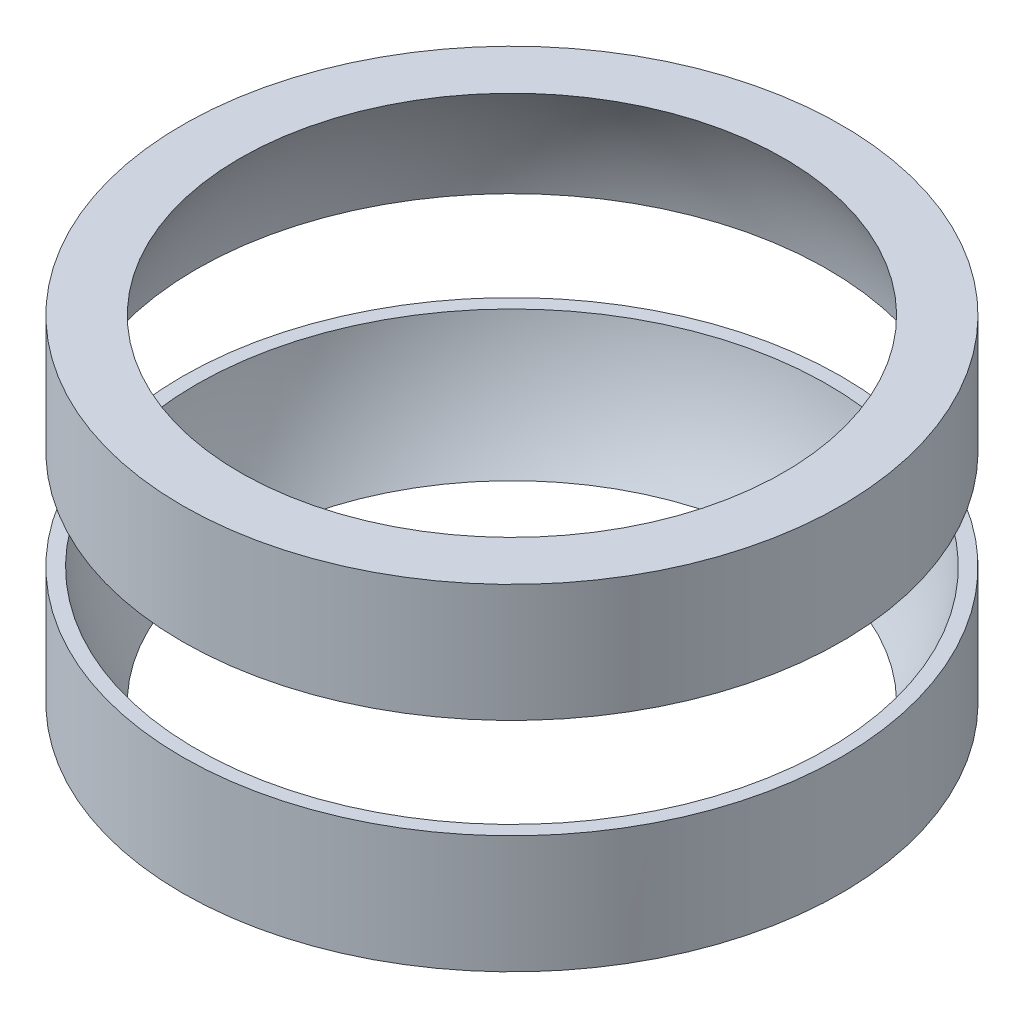
ISO-10303-21;
HEADER;
FILE_DESCRIPTION(('STEP AP214'),'2;1');
FILE_NAME('part.step','',(''),(''),'','','');
FILE_SCHEMA(('AUTOMOTIVE_DESIGN { 1 0 10303 214 1 1 1 1 }'));
ENDSEC;
DATA;
#1=APPLICATION_CONTEXT('core data for automotive mechanical design processes');
#2=APPLICATION_PROTOCOL_DEFINITION('international standard','automotive_design',2000,#1);
#3=PRODUCT_CONTEXT('',#1,'mechanical');
#4=PRODUCT('Part','Part','',(#3));
#5=PRODUCT_RELATED_PRODUCT_CATEGORY('part','',(#4));
#6=PRODUCT_DEFINITION_FORMATION('','',#4);
#7=PRODUCT_DEFINITION_CONTEXT('part definition',#1,'design');
#8=PRODUCT_DEFINITION('design','',#6,#7);
#9=PRODUCT_DEFINITION_SHAPE('','',#8);
#10=(LENGTH_UNIT() NAMED_UNIT(*) SI_UNIT(.MILLI.,.METRE.));
#11=(NAMED_UNIT(*) PLANE_ANGLE_UNIT() SI_UNIT($,.RADIAN.));
#12=(NAMED_UNIT(*) SI_UNIT($,.STERADIAN.) SOLID_ANGLE_UNIT());
#13=UNCERTAINTY_MEASURE_WITH_UNIT(LENGTH_MEASURE(1.E-05),#10,'distance_accuracy_value','');
#14=(GEOMETRIC_REPRESENTATION_CONTEXT(3) GLOBAL_UNCERTAINTY_ASSIGNED_CONTEXT((#13)) GLOBAL_UNIT_ASSIGNED_CONTEXT((#10,
#11,#12)) REPRESENTATION_CONTEXT('',''));
#15=CARTESIAN_POINT('',(0.,0.,0.));
#16=DIRECTION('',(0.,0.,1.));
#17=DIRECTION('',(1.,0.,0.));
#18=AXIS2_PLACEMENT_3D('',#15,#16,#17);
#19=CARTESIAN_POINT('',(0.,0.,0.));
#20=DIRECTION('',(0.,1.,0.));
#21=DIRECTION('',(-1.,0.,0.));
#22=AXIS2_PLACEMENT_3D('',#19,#20,#21);
#23=SPHERICAL_SURFACE('',#22,8.);
#24=CARTESIAN_POINT('',(0.,-1.25,0.));
#25=DIRECTION('',(0.,-1.,0.));
#26=DIRECTION('',(0.,0.,-1.));
#27=AXIS2_PLACEMENT_3D('',#24,#25,#26);
#28=CIRCLE('',#27,7.90174031463955);
#29=CARTESIAN_POINT('',(-7.90174031463955,-1.25,0.));
#30=VERTEX_POINT('',#29);
#31=EDGE_CURVE('E48',#30,#30,#28,.T.);
#32=CARTESIAN_POINT('',(0.,-4.2,0.));
#33=DIRECTION('',(0.,1.,0.));
#34=DIRECTION('',(0.,0.,1.));
#35=AXIS2_PLACEMENT_3D('',#32,#33,#34);
#36=CIRCLE('',#35,6.80881781221968);
#37=CARTESIAN_POINT('',(-6.80881781221968,-4.2,0.));
#38=VERTEX_POINT('',#37);
#39=EDGE_CURVE('E56',#38,#38,#36,.T.);
#40=CARTESIAN_POINT('',(-7.90174031463955,-1.25,0.));
#41=CARTESIAN_POINT('',(-7.89658639024555,-1.28258004946365,0.));
#42=CARTESIAN_POINT('',(-7.89123094559052,-1.31512821958967,0.));
#43=CARTESIAN_POINT('',(-7.88011788367745,-1.38015582955022,0.));
#44=CARTESIAN_POINT('',(-7.8743602664194,-1.41263526938476,0.));
#45=CARTESIAN_POINT('',(-7.86244372721932,-1.47752044714619,0.));
#46=CARTESIAN_POINT('',(-7.85628480527729,-1.50992618507308,0.));
#47=CARTESIAN_POINT('',(-7.84356660251608,-1.57465900149719,0.));
#48=CARTESIAN_POINT('',(-7.83700732169689,-1.60698607999442,0.));
#49=CARTESIAN_POINT('',(-7.82348940382575,-1.67155663131721,0.));
#50=CARTESIAN_POINT('',(-7.81653076677378,-1.70380010414277,0.));
#51=CARTESIAN_POINT('',(-7.80221520136718,-1.76819851087429,0.));
#52=CARTESIAN_POINT('',(-7.79485827301255,-1.80035344478024,0.));
#53=CARTESIAN_POINT('',(-7.77974725055261,-1.86456985391695,0.));
#54=CARTESIAN_POINT('',(-7.7719931564473,-1.89663132914771,0.));
#55=CARTESIAN_POINT('',(-7.75608898888983,-1.96065591549226,0.));
#56=CARTESIAN_POINT('',(-7.74793891543766,-1.99261902660606,0.));
#57=CARTESIAN_POINT('',(-7.73124403615285,-2.05644199432086,0.));
#58=CARTESIAN_POINT('',(-7.7226992303202,-2.08830185092187,0.));
#59=CARTESIAN_POINT('',(-7.70521619364142,-2.15191343501436,0.));
#60=CARTESIAN_POINT('',(-7.6962779627953,-2.18366516250585,0.));
#61=CARTESIAN_POINT('',(-7.67800944364946,-2.24705563032621,0.));
#62=CARTESIAN_POINT('',(-7.66867915534974,-2.27869437065507,0.));
#63=CARTESIAN_POINT('',(-7.6496279488423,-2.3418540233843,0.));
#64=CARTESIAN_POINT('',(-7.63990703063458,-2.37337493578467,0.));
#65=CARTESIAN_POINT('',(-7.62007605162346,-2.43629410991884,0.));
#66=CARTESIAN_POINT('',(-7.60996599082006,-2.46769237165265,0.));
#67=CARTESIAN_POINT('',(-7.58935827346923,-2.53036144048133,0.));
#68=CARTESIAN_POINT('',(-7.5788606169218,-2.56163224757621,0.));
#69=CARTESIAN_POINT('',(-7.55747931423717,-2.62404162265539,0.));
#70=CARTESIAN_POINT('',(-7.54659566809996,-2.65518019063969,0.));
#71=CARTESIAN_POINT('',(-7.52444405144693,-2.71732032325882,0.));
#72=CARTESIAN_POINT('',(-7.51317608093111,-2.74832188789365,0.));
#73=CARTESIAN_POINT('',(-7.49025753953406,-2.8101832705366,0.));
#74=CARTESIAN_POINT('',(-7.47860696865284,-2.84104308854473,0.));
#75=CARTESIAN_POINT('',(-7.45492500907658,-2.90261625634446,0.));
#76=CARTESIAN_POINT('',(-7.44289362038154,-2.93332960613607,0.));
#77=CARTESIAN_POINT('',(-7.41845186599478,-2.99460513832277,0.));
#78=CARTESIAN_POINT('',(-7.40604150030306,-3.02516732071786,0.));
#79=CARTESIAN_POINT('',(-7.38084369072406,-3.08613584206032,0.));
#80=CARTESIAN_POINT('',(-7.36805624683677,-3.11654218100769,0.));
#81=CARTESIAN_POINT('',(-7.34210623736114,-3.17719436324774,0.));
#82=CARTESIAN_POINT('',(-7.32894367177279,-3.20744020654042,0.));
#83=CARTESIAN_POINT('',(-7.30224543278365,-3.26776676982017,0.));
#84=CARTESIAN_POINT('',(-7.28870975938287,-3.29784748980723,0.));
#85=CARTESIAN_POINT('',(-7.26126737574332,-3.35783920408884,0.));
#86=CARTESIAN_POINT('',(-7.24736066550456,-3.38775019838337,0.));
#87=CARTESIAN_POINT('',(-7.21917833593301,-3.44739788486146,0.));
#88=CARTESIAN_POINT('',(-7.20490271660022,-3.47713457704502,0.));
#89=CARTESIAN_POINT('',(-7.17598475302667,-3.53642910955028,0.));
#90=CARTESIAN_POINT('',(-7.16134240878591,-3.56598694987199,0.));
#91=CARTESIAN_POINT('',(-7.13169323569713,-3.62491925627043,0.));
#92=CARTESIAN_POINT('',(-7.11668640684912,-3.65429372234716,0.));
#93=CARTESIAN_POINT('',(-7.08631056059334,-3.71285478591711,0.));
#94=CARTESIAN_POINT('',(-7.07094154318558,-3.74204138341033,0.));
#95=CARTESIAN_POINT('',(-7.03984367134705,-3.80022224426321,0.));
#96=CARTESIAN_POINT('',(-7.02411481691628,-3.82921650762287,0.));
#97=CARTESIAN_POINT('',(-6.99229967734802,-3.88700826392039,0.));
#98=CARTESIAN_POINT('',(-6.97621339221052,-3.91580575685825,0.));
#99=CARTESIAN_POINT('',(-6.94368585326228,-3.97319956674786,0.));
#100=CARTESIAN_POINT('',(-6.92724459945153,-4.0017958836996,0.));
#101=CARTESIAN_POINT('',(-6.89400963565749,-4.05878296452717,0.));
#102=CARTESIAN_POINT('',(-6.8772159256742,-4.087173728403,0.));
#103=CARTESIAN_POINT('',(-6.84327863030572,-4.14374536604359,0.));
#104=CARTESIAN_POINT('',(-6.82613504492052,-4.17192623980835,0.));
#105=CARTESIAN_POINT('',(-6.80881781221968,-4.2,0.));
#106=B_SPLINE_CURVE_WITH_KNOTS('',3,(#40,#41,#42,#43,#44,#45,#46,#47,#48,#49,#50,#51,#52,#53,
#54,#55,#56,#57,#58,#59,#60,#61,#62,#63,#64,#65,#66,#67,#68,#69,#70,#71,#72,#73,#74,#75,#76,#77,
#78,#79,#80,#81,#82,#83,#84,#85,#86,#87,#88,#89,#90,#91,#92,#93,#94,#95,#96,#97,#98,#99,#100,
#101,#102,#103,#104,#105),.UNSPECIFIED.,.F.,.F.,(4,2,2,2,2,2,2,2,2,2,2,2,2,2,2,2,2,2,2,2,2,2,2,
2,2,2,2,2,2,2,2,2,4),(0.,0.0989549296655132,0.197909859331026,0.29686478899654,
0.395819718662053,0.494774648327566,0.593729577993079,0.692684507658593,0.791639437324106,
0.890594366989619,0.989549296655132,1.08850422632065,1.18745915598616,1.28641408565167,
1.38536901531719,1.4843239449827,1.58327887464821,1.68223380431372,1.78118873397924,
1.88014366364475,1.97909859331026,2.07805352297578,2.17700845264129,2.2759633823068,
2.37491831197232,2.47387324163783,2.57282817130334,2.67178310096886,2.77073803063437,
2.86969296029988,2.9686478899654,3.06760281963091,3.16655774929642),.UNSPECIFIED.);
#107=EDGE_CURVE('BSEAM44',#30,#38,#106,.T.);
#108=ORIENTED_EDGE('',*,*,#31,.F.);
#109=ORIENTED_EDGE('',*,*,#39,.F.);
#110=ORIENTED_EDGE('',*,*,#107,.T.);
#111=ORIENTED_EDGE('',*,*,#107,.F.);
#112=EDGE_LOOP('',(#108,#110,#109,#111));
#113=FACE_BOUND('',#112,.T.);
#114=ADVANCED_FACE('F44',(#113),#23,.F.);
#115=CARTESIAN_POINT('',(0.,4.2,0.));
#116=DIRECTION('',(0.,1.,0.));
#117=DIRECTION('',(0.,0.,1.));
#118=AXIS2_PLACEMENT_3D('',#115,#116,#117);
#119=CYLINDRICAL_SURFACE('',#118,8.25);
#120=CARTESIAN_POINT('',(0.,-1.25,0.));
#121=DIRECTION('',(0.,-1.,0.));
#122=DIRECTION('',(0.,0.,-1.));
#123=AXIS2_PLACEMENT_3D('',#120,#121,#122);
#124=CIRCLE('',#123,8.25);
#125=CARTESIAN_POINT('',(0.,-1.25,-8.25));
#126=VERTEX_POINT('',#125);
#127=EDGE_CURVE('E11',#126,#126,#124,.F.);
#128=ORIENTED_EDGE('',*,*,#127,.F.);
#129=EDGE_LOOP('',(#128));
#130=FACE_BOUND('',#129,.T.);
#131=CARTESIAN_POINT('',(0.,-4.2,0.));
#132=DIRECTION('',(0.,1.,0.));
#133=DIRECTION('',(0.,0.,1.));
#134=AXIS2_PLACEMENT_3D('',#131,#132,#133);
#135=CIRCLE('',#134,8.25);
#136=CARTESIAN_POINT('',(0.,-4.2,8.25));
#137=VERTEX_POINT('',#136);
#138=EDGE_CURVE('E59',#137,#137,#135,.T.);
#139=ORIENTED_EDGE('',*,*,#138,.T.);
#140=EDGE_LOOP('',(#139));
#141=FACE_BOUND('',#140,.T.);
#142=ADVANCED_FACE('F46',(#130,#141),#119,.T.);
#143=CARTESIAN_POINT('',(-6.80881781221968,-4.2,0.));
#144=DIRECTION('',(0.,-1.,0.));
#145=DIRECTION('',(0.,0.,-1.));
#146=AXIS2_PLACEMENT_3D('',#143,#144,#145);
#147=PLANE('',#146);
#148=ORIENTED_EDGE('',*,*,#39,.T.);
#149=EDGE_LOOP('',(#148));
#150=FACE_BOUND('',#149,.T.);
#151=ORIENTED_EDGE('',*,*,#138,.F.);
#152=EDGE_LOOP('',(#151));
#153=FACE_BOUND('',#152,.T.);
#154=ADVANCED_FACE('F64',(#150,#153),#147,.T.);
#155=CARTESIAN_POINT('',(-8.25,-1.25,-8.25));
#156=DIRECTION('',(0.,-1.,0.));
#157=DIRECTION('',(0.,0.,-1.));
#158=AXIS2_PLACEMENT_3D('',#155,#156,#157);
#159=PLANE('',#158);
#160=ORIENTED_EDGE('',*,*,#31,.T.);
#161=EDGE_LOOP('',(#160));
#162=FACE_BOUND('',#161,.T.);
#163=ORIENTED_EDGE('',*,*,#127,.T.);
#164=EDGE_LOOP('',(#163));
#165=FACE_BOUND('',#164,.T.);
#166=ADVANCED_FACE('F66',(#162,#165),#159,.F.);
#167=CLOSED_SHELL('',(#114,#142,#154,#166));
#168=MANIFOLD_SOLID_BREP('B2',#167);
#169=CARTESIAN_POINT('',(0.,0.,0.));
#170=DIRECTION('',(0.,1.,0.));
#171=DIRECTION('',(-1.,0.,0.));
#172=AXIS2_PLACEMENT_3D('',#169,#170,#171);
#173=SPHERICAL_SURFACE('',#172,8.);
#174=CARTESIAN_POINT('',(0.,1.25,0.));
#175=DIRECTION('',(0.,1.,0.));
#176=DIRECTION('',(0.,0.,1.));
#177=AXIS2_PLACEMENT_3D('',#174,#175,#176);
#178=CIRCLE('',#177,7.90174031463955);
#179=CARTESIAN_POINT('',(-7.90174031463955,1.25,0.));
#180=VERTEX_POINT('',#179);
#181=EDGE_CURVE('E119',#180,#180,#178,.T.);
#182=CARTESIAN_POINT('',(0.,4.2,0.));
#183=DIRECTION('',(0.,1.,0.));
#184=DIRECTION('',(0.,0.,1.));
#185=AXIS2_PLACEMENT_3D('',#182,#183,#184);
#186=CIRCLE('',#185,6.80881781221968);
#187=CARTESIAN_POINT('',(-6.80881781221968,4.2,0.));
#188=VERTEX_POINT('',#187);
#189=EDGE_CURVE('E111',#188,#188,#186,.T.);
#190=CARTESIAN_POINT('',(-7.90174031463955,1.25,0.));
#191=CARTESIAN_POINT('',(-7.89658639024555,1.28258004946365,0.));
#192=CARTESIAN_POINT('',(-7.89123094559052,1.31512821958967,0.));
#193=CARTESIAN_POINT('',(-7.88011788367745,1.38015582955022,0.));
#194=CARTESIAN_POINT('',(-7.8743602664194,1.41263526938476,0.));
#195=CARTESIAN_POINT('',(-7.86244372721932,1.47752044714619,0.));
#196=CARTESIAN_POINT('',(-7.85628480527729,1.50992618507308,0.));
#197=CARTESIAN_POINT('',(-7.84356660251608,1.57465900149719,0.));
#198=CARTESIAN_POINT('',(-7.83700732169689,1.60698607999442,0.));
#199=CARTESIAN_POINT('',(-7.82348940382575,1.67155663131721,0.));
#200=CARTESIAN_POINT('',(-7.81653076677378,1.70380010414277,0.));
#201=CARTESIAN_POINT('',(-7.80221520136718,1.76819851087429,0.));
#202=CARTESIAN_POINT('',(-7.79485827301255,1.80035344478024,0.));
#203=CARTESIAN_POINT('',(-7.77974725055261,1.86456985391695,0.));
#204=CARTESIAN_POINT('',(-7.7719931564473,1.89663132914771,0.));
#205=CARTESIAN_POINT('',(-7.75608898888983,1.96065591549226,0.));
#206=CARTESIAN_POINT('',(-7.74793891543766,1.99261902660606,0.));
#207=CARTESIAN_POINT('',(-7.73124403615285,2.05644199432086,0.));
#208=CARTESIAN_POINT('',(-7.7226992303202,2.08830185092187,0.));
#209=CARTESIAN_POINT('',(-7.70521619364142,2.15191343501436,0.));
#210=CARTESIAN_POINT('',(-7.6962779627953,2.18366516250585,0.));
#211=CARTESIAN_POINT('',(-7.67800944364946,2.24705563032621,0.));
#212=CARTESIAN_POINT('',(-7.66867915534974,2.27869437065507,0.));
#213=CARTESIAN_POINT('',(-7.6496279488423,2.3418540233843,0.));
#214=CARTESIAN_POINT('',(-7.63990703063458,2.37337493578467,0.));
#215=CARTESIAN_POINT('',(-7.62007605162346,2.43629410991884,0.));
#216=CARTESIAN_POINT('',(-7.60996599082006,2.46769237165265,0.));
#217=CARTESIAN_POINT('',(-7.58935827346923,2.53036144048133,0.));
#218=CARTESIAN_POINT('',(-7.5788606169218,2.56163224757621,0.));
#219=CARTESIAN_POINT('',(-7.55747931423717,2.62404162265539,0.));
#220=CARTESIAN_POINT('',(-7.54659566809996,2.65518019063969,0.));
#221=CARTESIAN_POINT('',(-7.52444405144693,2.71732032325882,0.));
#222=CARTESIAN_POINT('',(-7.5131760809311,2.74832188789365,0.));
#223=CARTESIAN_POINT('',(-7.49025753953406,2.8101832705366,0.));
#224=CARTESIAN_POINT('',(-7.47860696865284,2.84104308854473,0.));
#225=CARTESIAN_POINT('',(-7.45492500907658,2.90261625634446,0.));
#226=CARTESIAN_POINT('',(-7.44289362038154,2.93332960613607,0.));
#227=CARTESIAN_POINT('',(-7.41845186599478,2.99460513832277,0.));
#228=CARTESIAN_POINT('',(-7.40604150030306,3.02516732071786,0.));
#229=CARTESIAN_POINT('',(-7.38084369072406,3.08613584206032,0.));
#230=CARTESIAN_POINT('',(-7.36805624683677,3.1165421810077,0.));
#231=CARTESIAN_POINT('',(-7.34210623736114,3.17719436324775,0.));
#232=CARTESIAN_POINT('',(-7.32894367177279,3.20744020654042,0.));
#233=CARTESIAN_POINT('',(-7.30224543278365,3.26776676982017,0.));
#234=CARTESIAN_POINT('',(-7.28870975938287,3.29784748980724,0.));
#235=CARTESIAN_POINT('',(-7.26126737574332,3.35783920408884,0.));
#236=CARTESIAN_POINT('',(-7.24736066550456,3.38775019838337,0.));
#237=CARTESIAN_POINT('',(-7.21917833593301,3.44739788486146,0.));
#238=CARTESIAN_POINT('',(-7.20490271660022,3.47713457704502,0.));
#239=CARTESIAN_POINT('',(-7.17598475302667,3.53642910955028,0.));
#240=CARTESIAN_POINT('',(-7.16134240878591,3.56598694987199,0.));
#241=CARTESIAN_POINT('',(-7.13169323569713,3.62491925627043,0.));
#242=CARTESIAN_POINT('',(-7.11668640684911,3.65429372234716,0.));
#243=CARTESIAN_POINT('',(-7.08631056059334,3.71285478591711,0.));
#244=CARTESIAN_POINT('',(-7.07094154318558,3.74204138341033,0.));
#245=CARTESIAN_POINT('',(-7.03984367134705,3.80022224426321,0.));
#246=CARTESIAN_POINT('',(-7.02411481691628,3.82921650762287,0.));
#247=CARTESIAN_POINT('',(-6.99229967734801,3.88700826392039,0.));
#248=CARTESIAN_POINT('',(-6.97621339221052,3.91580575685825,0.));
#249=CARTESIAN_POINT('',(-6.94368585326228,3.97319956674786,0.));
#250=CARTESIAN_POINT('',(-6.92724459945153,4.0017958836996,0.));
#251=CARTESIAN_POINT('',(-6.89400963565749,4.05878296452717,0.));
#252=CARTESIAN_POINT('',(-6.8772159256742,4.087173728403,0.));
#253=CARTESIAN_POINT('',(-6.84327863030571,4.14374536604359,0.));
#254=CARTESIAN_POINT('',(-6.82613504492052,4.17192623980835,0.));
#255=CARTESIAN_POINT('',(-6.80881781221968,4.2,0.));
#256=B_SPLINE_CURVE_WITH_KNOTS('',3,(#190,#191,#192,#193,#194,#195,#196,#197,#198,#199,#200,
#201,#202,#203,#204,#205,#206,#207,#208,#209,#210,#211,#212,#213,#214,#215,#216,#217,#218,#219,
#220,#221,#222,#223,#224,#225,#226,#227,#228,#229,#230,#231,#232,#233,#234,#235,#236,#237,#238,
#239,#240,#241,#242,#243,#244,#245,#246,#247,#248,#249,#250,#251,#252,#253,#254,#255),
.UNSPECIFIED.,.F.,.F.,(4,2,2,2,2,2,2,2,2,2,2,2,2,2,2,2,2,2,2,2,2,2,2,2,2,2,2,2,2,2,2,2,4),(0.,
0.0989549296655132,0.197909859331026,0.29686478899654,0.395819718662053,0.494774648327567,
0.593729577993079,0.692684507658593,0.791639437324106,0.89059436698962,0.989549296655133,
1.08850422632065,1.18745915598616,1.28641408565167,1.38536901531719,1.4843239449827,
1.58327887464821,1.68223380431373,1.78118873397924,1.88014366364475,1.97909859331027,
2.07805352297578,2.17700845264129,2.27596338230681,2.37491831197232,2.47387324163783,
2.57282817130335,2.67178310096886,2.77073803063437,2.86969296029989,2.9686478899654,
3.06760281963091,3.16655774929643),.UNSPECIFIED.);
#257=EDGE_CURVE('BSEAM105',#180,#188,#256,.T.);
#258=ORIENTED_EDGE('',*,*,#181,.F.);
#259=ORIENTED_EDGE('',*,*,#189,.T.);
#260=ORIENTED_EDGE('',*,*,#257,.T.);
#261=ORIENTED_EDGE('',*,*,#257,.F.);
#262=EDGE_LOOP('',(#258,#260,#259,#261));
#263=FACE_BOUND('',#262,.T.);
#264=ADVANCED_FACE('F105',(#263),#173,.F.);
#265=CARTESIAN_POINT('',(-8.25,4.2,0.));
#266=DIRECTION('',(0.,1.,0.));
#267=DIRECTION('',(0.,0.,1.));
#268=AXIS2_PLACEMENT_3D('',#265,#266,#267);
#269=PLANE('',#268);
#270=CARTESIAN_POINT('',(0.,4.2,0.));
#271=DIRECTION('',(0.,1.,0.));
#272=DIRECTION('',(0.,0.,1.));
#273=AXIS2_PLACEMENT_3D('',#270,#271,#272);
#274=CIRCLE('',#273,8.25);
#275=CARTESIAN_POINT('',(0.,4.2,8.25));
#276=VERTEX_POINT('',#275);
#277=EDGE_CURVE('E115',#276,#276,#274,.T.);
#278=ORIENTED_EDGE('',*,*,#277,.T.);
#279=EDGE_LOOP('',(#278));
#280=FACE_BOUND('',#279,.T.);
#281=ORIENTED_EDGE('',*,*,#189,.F.);
#282=EDGE_LOOP('',(#281));
#283=FACE_BOUND('',#282,.T.);
#284=ADVANCED_FACE('F128',(#280,#283),#269,.T.);
#285=CARTESIAN_POINT('',(0.,4.2,0.));
#286=DIRECTION('',(0.,1.,0.));
#287=DIRECTION('',(0.,0.,1.));
#288=AXIS2_PLACEMENT_3D('',#285,#286,#287);
#289=CYLINDRICAL_SURFACE('',#288,8.25);
#290=CARTESIAN_POINT('',(0.,1.25,0.));
#291=DIRECTION('',(0.,1.,0.));
#292=DIRECTION('',(0.,0.,1.));
#293=AXIS2_PLACEMENT_3D('',#290,#291,#292);
#294=CIRCLE('',#293,8.25);
#295=CARTESIAN_POINT('',(0.,1.25,8.25));
#296=VERTEX_POINT('',#295);
#297=EDGE_CURVE('E43',#296,#296,#294,.F.);
#298=ORIENTED_EDGE('',*,*,#297,.F.);
#299=EDGE_LOOP('',(#298));
#300=FACE_BOUND('',#299,.T.);
#301=ORIENTED_EDGE('',*,*,#277,.F.);
#302=EDGE_LOOP('',(#301));
#303=FACE_BOUND('',#302,.T.);
#304=ADVANCED_FACE('F132',(#300,#303),#289,.T.);
#305=CARTESIAN_POINT('',(-8.25,1.25,-8.25));
#306=DIRECTION('',(0.,1.,0.));
#307=DIRECTION('',(0.,0.,1.));
#308=AXIS2_PLACEMENT_3D('',#305,#306,#307);
#309=PLANE('',#308);
#310=ORIENTED_EDGE('',*,*,#181,.T.);
#311=EDGE_LOOP('',(#310));
#312=FACE_BOUND('',#311,.T.);
#313=ORIENTED_EDGE('',*,*,#297,.T.);
#314=EDGE_LOOP('',(#313));
#315=FACE_BOUND('',#314,.T.);
#316=ADVANCED_FACE('F125',(#312,#315),#309,.F.);
#317=CLOSED_SHELL('',(#264,#284,#304,#316));
#318=MANIFOLD_SOLID_BREP('B6',#317);
#319=ADVANCED_BREP_SHAPE_REPRESENTATION('',(#18,#168,#318),#14);
#320=SHAPE_DEFINITION_REPRESENTATION(#9,#319);
ENDSEC;
END-ISO-10303-21;
